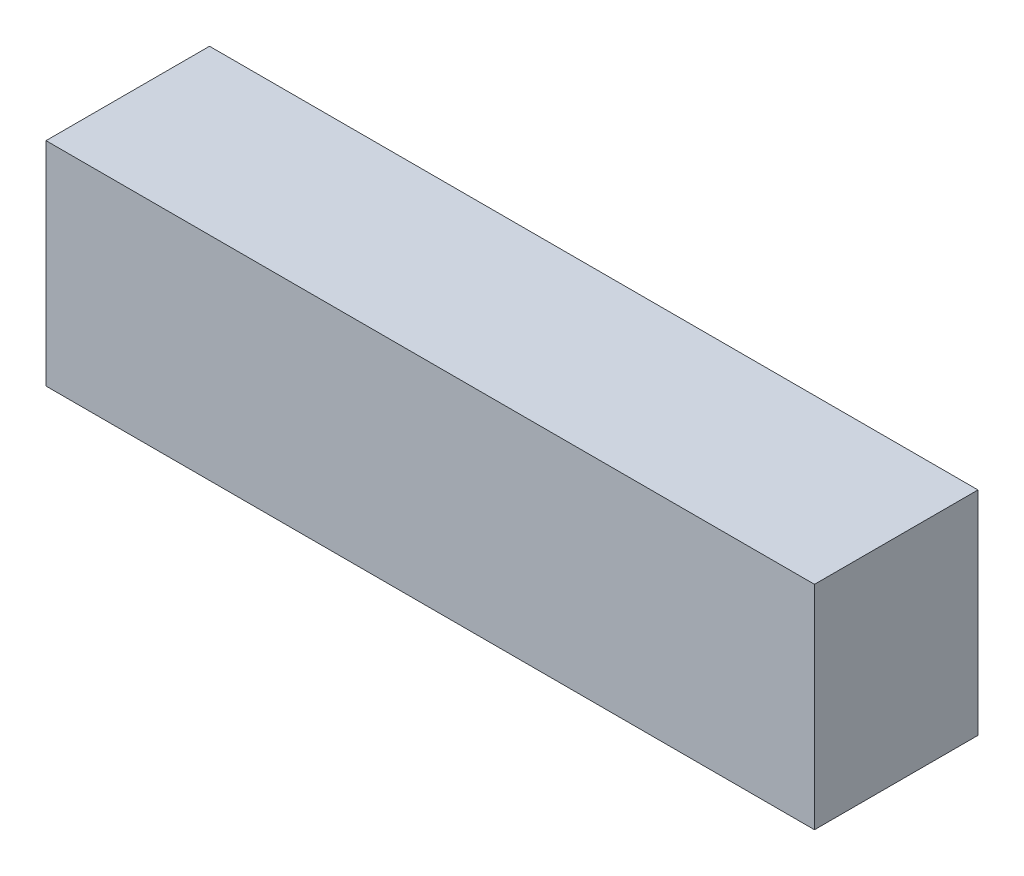
ISO-10303-21;
HEADER;
FILE_DESCRIPTION(('STEP AP214'),'2;1');
FILE_NAME('part.step','',(''),(''),'','','');
FILE_SCHEMA(('AUTOMOTIVE_DESIGN { 1 0 10303 214 1 1 1 1 }'));
ENDSEC;
DATA;
#1=APPLICATION_CONTEXT('core data for automotive mechanical design processes');
#2=APPLICATION_PROTOCOL_DEFINITION('international standard','automotive_design',2000,#1);
#3=PRODUCT_CONTEXT('',#1,'mechanical');
#4=PRODUCT('Part','Part','',(#3));
#5=PRODUCT_RELATED_PRODUCT_CATEGORY('part','',(#4));
#6=PRODUCT_DEFINITION_FORMATION('','',#4);
#7=PRODUCT_DEFINITION_CONTEXT('part definition',#1,'design');
#8=PRODUCT_DEFINITION('design','',#6,#7);
#9=PRODUCT_DEFINITION_SHAPE('','',#8);
#10=(LENGTH_UNIT() NAMED_UNIT(*) SI_UNIT(.MILLI.,.METRE.));
#11=(NAMED_UNIT(*) PLANE_ANGLE_UNIT() SI_UNIT($,.RADIAN.));
#12=(NAMED_UNIT(*) SI_UNIT($,.STERADIAN.) SOLID_ANGLE_UNIT());
#13=UNCERTAINTY_MEASURE_WITH_UNIT(LENGTH_MEASURE(1.E-05),#10,'distance_accuracy_value','');
#14=(GEOMETRIC_REPRESENTATION_CONTEXT(3) GLOBAL_UNCERTAINTY_ASSIGNED_CONTEXT((#13)) GLOBAL_UNIT_ASSIGNED_CONTEXT((#10,
#11,#12)) REPRESENTATION_CONTEXT('',''));
#15=CARTESIAN_POINT('',(0.,0.,0.));
#16=DIRECTION('',(0.,0.,1.));
#17=DIRECTION('',(1.,0.,0.));
#18=AXIS2_PLACEMENT_3D('',#15,#16,#17);
#19=CARTESIAN_POINT('',(59.69,33.02,12.7));
#20=DIRECTION('',(-1.,0.,0.));
#21=DIRECTION('',(0.,0.,1.));
#22=AXIS2_PLACEMENT_3D('',#19,#20,#21);
#23=PLANE('',#22);
#24=DIRECTION('',(0.,0.,-1.));
#25=VECTOR('',#24,1.);
#26=CARTESIAN_POINT('',(59.69,0.,12.7));
#27=LINE('',#26,#25);
#28=CARTESIAN_POINT('',(59.69,0.,12.7));
#29=VERTEX_POINT('',#28);
#30=CARTESIAN_POINT('',(59.69,0.,-12.7));
#31=VERTEX_POINT('',#30);
#32=EDGE_CURVE('E111',#29,#31,#27,.T.);
#33=ORIENTED_EDGE('',*,*,#32,.T.);
#34=DIRECTION('',(0.,-1.,0.));
#35=VECTOR('',#34,1.);
#36=CARTESIAN_POINT('',(59.69,33.02,-12.7));
#37=LINE('',#36,#35);
#38=CARTESIAN_POINT('',(59.69,33.02,-12.7));
#39=VERTEX_POINT('',#38);
#40=EDGE_CURVE('E11',#39,#31,#37,.T.);
#41=ORIENTED_EDGE('',*,*,#40,.F.);
#42=DIRECTION('',(0.,0.,-1.));
#43=VECTOR('',#42,1.);
#44=CARTESIAN_POINT('',(59.69,33.02,12.7));
#45=LINE('',#44,#43);
#46=CARTESIAN_POINT('',(59.69,33.02,12.7));
#47=VERTEX_POINT('',#46);
#48=EDGE_CURVE('E95',#47,#39,#45,.T.);
#49=ORIENTED_EDGE('',*,*,#48,.F.);
#50=DIRECTION('',(0.,-1.,0.));
#51=VECTOR('',#50,1.);
#52=CARTESIAN_POINT('',(59.69,33.02,12.7));
#53=LINE('',#52,#51);
#54=EDGE_CURVE('E107',#47,#29,#53,.T.);
#55=ORIENTED_EDGE('',*,*,#54,.T.);
#56=EDGE_LOOP('',(#33,#41,#49,#55));
#57=FACE_BOUND('',#56,.T.);
#58=ADVANCED_FACE('F43',(#57),#23,.F.);
#59=CARTESIAN_POINT('',(-59.69,33.02,-12.7));
#60=DIRECTION('',(0.,0.,1.));
#61=DIRECTION('',(1.,0.,0.));
#62=AXIS2_PLACEMENT_3D('',#59,#60,#61);
#63=PLANE('',#62);
#64=DIRECTION('',(-1.,0.,0.));
#65=VECTOR('',#64,1.);
#66=CARTESIAN_POINT('',(-59.69,0.,-12.7));
#67=LINE('',#66,#65);
#68=CARTESIAN_POINT('',(-59.69,0.,-12.7));
#69=VERTEX_POINT('',#68);
#70=EDGE_CURVE('E100',#31,#69,#67,.T.);
#71=ORIENTED_EDGE('',*,*,#70,.T.);
#72=DIRECTION('',(0.,-1.,0.));
#73=VECTOR('',#72,1.);
#74=CARTESIAN_POINT('',(-59.69,33.02,-12.7));
#75=LINE('',#74,#73);
#76=CARTESIAN_POINT('',(-59.69,33.02,-12.7));
#77=VERTEX_POINT('',#76);
#78=EDGE_CURVE('E52',#77,#69,#75,.T.);
#79=ORIENTED_EDGE('',*,*,#78,.F.);
#80=DIRECTION('',(-1.,0.,0.));
#81=VECTOR('',#80,1.);
#82=CARTESIAN_POINT('',(-59.69,33.02,-12.7));
#83=LINE('',#82,#81);
#84=EDGE_CURVE('E90',#39,#77,#83,.T.);
#85=ORIENTED_EDGE('',*,*,#84,.F.);
#86=ORIENTED_EDGE('',*,*,#40,.T.);
#87=EDGE_LOOP('',(#71,#79,#85,#86));
#88=FACE_BOUND('',#87,.T.);
#89=ADVANCED_FACE('F99',(#88),#63,.F.);
#90=CARTESIAN_POINT('',(-59.69,33.02,12.7));
#91=DIRECTION('',(1.,0.,0.));
#92=DIRECTION('',(0.,0.,-1.));
#93=AXIS2_PLACEMENT_3D('',#90,#91,#92);
#94=PLANE('',#93);
#95=DIRECTION('',(0.,0.,1.));
#96=VECTOR('',#95,1.);
#97=CARTESIAN_POINT('',(-59.69,0.,12.7));
#98=LINE('',#97,#96);
#99=CARTESIAN_POINT('',(-59.69,0.,12.7));
#100=VERTEX_POINT('',#99);
#101=EDGE_CURVE('E77',#69,#100,#98,.T.);
#102=ORIENTED_EDGE('',*,*,#101,.T.);
#103=DIRECTION('',(0.,-1.,0.));
#104=VECTOR('',#103,1.);
#105=CARTESIAN_POINT('',(-59.69,33.02,12.7));
#106=LINE('',#105,#104);
#107=CARTESIAN_POINT('',(-59.69,33.02,12.7));
#108=VERTEX_POINT('',#107);
#109=EDGE_CURVE('E102',#108,#100,#106,.T.);
#110=ORIENTED_EDGE('',*,*,#109,.F.);
#111=DIRECTION('',(0.,0.,1.));
#112=VECTOR('',#111,1.);
#113=CARTESIAN_POINT('',(-59.69,33.02,12.7));
#114=LINE('',#113,#112);
#115=EDGE_CURVE('E93',#77,#108,#114,.T.);
#116=ORIENTED_EDGE('',*,*,#115,.F.);
#117=ORIENTED_EDGE('',*,*,#78,.T.);
#118=EDGE_LOOP('',(#102,#110,#116,#117));
#119=FACE_BOUND('',#118,.T.);
#120=ADVANCED_FACE('F103',(#119),#94,.F.);
#121=CARTESIAN_POINT('',(-59.69,33.02,12.7));
#122=DIRECTION('',(0.,0.,-1.));
#123=DIRECTION('',(-1.,0.,0.));
#124=AXIS2_PLACEMENT_3D('',#121,#122,#123);
#125=PLANE('',#124);
#126=DIRECTION('',(1.,0.,0.));
#127=VECTOR('',#126,1.);
#128=CARTESIAN_POINT('',(-59.69,0.,12.7));
#129=LINE('',#128,#127);
#130=EDGE_CURVE('E83',#100,#29,#129,.T.);
#131=ORIENTED_EDGE('',*,*,#130,.T.);
#132=ORIENTED_EDGE('',*,*,#54,.F.);
#133=DIRECTION('',(1.,0.,0.));
#134=VECTOR('',#133,1.);
#135=CARTESIAN_POINT('',(-59.69,33.02,12.7));
#136=LINE('',#135,#134);
#137=EDGE_CURVE('E60',#108,#47,#136,.T.);
#138=ORIENTED_EDGE('',*,*,#137,.F.);
#139=ORIENTED_EDGE('',*,*,#109,.T.);
#140=EDGE_LOOP('',(#131,#132,#138,#139));
#141=FACE_BOUND('',#140,.T.);
#142=ADVANCED_FACE('F124',(#141),#125,.F.);
#143=CARTESIAN_POINT('',(0.,33.02,0.));
#144=DIRECTION('',(0.,-1.,0.));
#145=DIRECTION('',(0.,0.,-1.));
#146=AXIS2_PLACEMENT_3D('',#143,#144,#145);
#147=PLANE('',#146);
#148=ORIENTED_EDGE('',*,*,#48,.T.);
#149=ORIENTED_EDGE('',*,*,#84,.T.);
#150=ORIENTED_EDGE('',*,*,#115,.T.);
#151=ORIENTED_EDGE('',*,*,#137,.T.);
#152=EDGE_LOOP('',(#148,#149,#150,#151));
#153=FACE_BOUND('',#152,.T.);
#154=ADVANCED_FACE('F91',(#153),#147,.F.);
#155=CARTESIAN_POINT('',(0.,0.,0.));
#156=DIRECTION('',(0.,-1.,0.));
#157=DIRECTION('',(0.,0.,-1.));
#158=AXIS2_PLACEMENT_3D('',#155,#156,#157);
#159=PLANE('',#158);
#160=ORIENTED_EDGE('',*,*,#32,.F.);
#161=ORIENTED_EDGE('',*,*,#130,.F.);
#162=ORIENTED_EDGE('',*,*,#101,.F.);
#163=ORIENTED_EDGE('',*,*,#70,.F.);
#164=EDGE_LOOP('',(#160,#161,#162,#163));
#165=FACE_BOUND('',#164,.T.);
#166=ADVANCED_FACE('F127',(#165),#159,.T.);
#167=CLOSED_SHELL('',(#58,#89,#120,#142,#154,#166));
#168=MANIFOLD_SOLID_BREP('B2',#167);
#169=ADVANCED_BREP_SHAPE_REPRESENTATION('',(#18,#168),#14);
#170=SHAPE_DEFINITION_REPRESENTATION(#9,#169);
ENDSEC;
END-ISO-10303-21;
